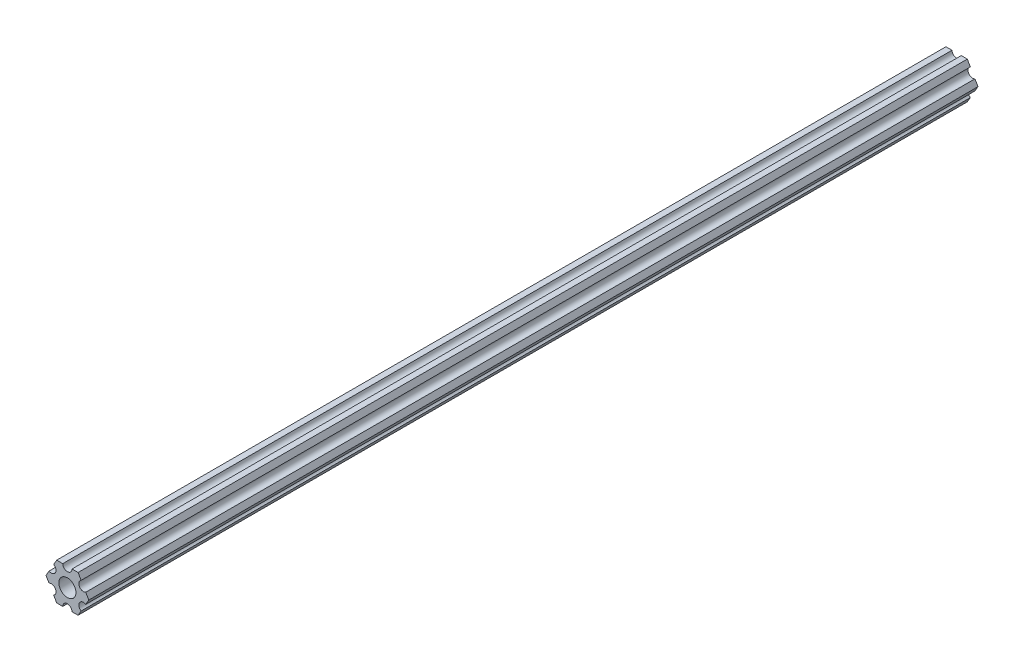
ISO-10303-21;
HEADER;
FILE_DESCRIPTION(('STEP AP214'),'2;1');
FILE_NAME('part.step','',(''),(''),'','','');
FILE_SCHEMA(('AUTOMOTIVE_DESIGN { 1 0 10303 214 1 1 1 1 }'));
ENDSEC;
DATA;
#1=APPLICATION_CONTEXT('core data for automotive mechanical design processes');
#2=APPLICATION_PROTOCOL_DEFINITION('international standard','automotive_design',2000,#1);
#3=PRODUCT_CONTEXT('',#1,'mechanical');
#4=PRODUCT('Part','Part','',(#3));
#5=PRODUCT_RELATED_PRODUCT_CATEGORY('part','',(#4));
#6=PRODUCT_DEFINITION_FORMATION('','',#4);
#7=PRODUCT_DEFINITION_CONTEXT('part definition',#1,'design');
#8=PRODUCT_DEFINITION('design','',#6,#7);
#9=PRODUCT_DEFINITION_SHAPE('','',#8);
#10=(LENGTH_UNIT() NAMED_UNIT(*) SI_UNIT(.MILLI.,.METRE.));
#11=(NAMED_UNIT(*) PLANE_ANGLE_UNIT() SI_UNIT($,.RADIAN.));
#12=(NAMED_UNIT(*) SI_UNIT($,.STERADIAN.) SOLID_ANGLE_UNIT());
#13=UNCERTAINTY_MEASURE_WITH_UNIT(LENGTH_MEASURE(1.E-05),#10,'distance_accuracy_value','');
#14=(GEOMETRIC_REPRESENTATION_CONTEXT(3) GLOBAL_UNCERTAINTY_ASSIGNED_CONTEXT((#13)) GLOBAL_UNIT_ASSIGNED_CONTEXT((#10,
#11,#12)) REPRESENTATION_CONTEXT('',''));
#15=CARTESIAN_POINT('',(0.,0.,0.));
#16=DIRECTION('',(0.,0.,1.));
#17=DIRECTION('',(1.,0.,0.));
#18=AXIS2_PLACEMENT_3D('',#15,#16,#17);
#19=CARTESIAN_POINT('',(6.29301142309098,-1.80018429024546,304.8));
#20=DIRECTION('',(-0.866025434075723,0.499999947533953,0.));
#21=DIRECTION('',(-0.499999947533953,-0.866025434075723,0.));
#22=AXIS2_PLACEMENT_3D('',#19,#20,#21);
#23=PLANE('',#22);
#24=DIRECTION('',(0.,0.,1.));
#25=VECTOR('',#24,1.);
#26=CARTESIAN_POINT('',(7.33234841870826,4.44212519169686E-07,304.8));
#27=LINE('',#26,#25);
#28=CARTESIAN_POINT('',(7.33234841870826,4.44212518961143E-07,0.));
#29=VERTEX_POINT('',#28);
#30=CARTESIAN_POINT('',(7.33234841870826,4.44212519315656E-07,304.8));
#31=VERTEX_POINT('',#30);
#32=EDGE_CURVE('E337',#29,#31,#27,.T.);
#33=ORIENTED_EDGE('',*,*,#32,.T.);
#34=DIRECTION('',(0.499999947533953,0.866025434075723,0.));
#35=VECTOR('',#34,1.);
#36=CARTESIAN_POINT('',(6.29301142309098,-1.80018429024546,304.8));
#37=LINE('',#36,#35);
#38=CARTESIAN_POINT('',(6.29301142309098,-1.80018429024546,304.8));
#39=VERTEX_POINT('',#38);
#40=EDGE_CURVE('E191',#39,#31,#37,.T.);
#41=ORIENTED_EDGE('',*,*,#40,.F.);
#42=DIRECTION('',(0.,0.,-1.));
#43=VECTOR('',#42,1.);
#44=CARTESIAN_POINT('',(6.29301142309098,-1.80018429024546,304.8));
#45=LINE('',#44,#43);
#46=CARTESIAN_POINT('',(6.29301142309098,-1.80018429024546,0.));
#47=VERTEX_POINT('',#46);
#48=EDGE_CURVE('E270',#39,#47,#45,.T.);
#49=ORIENTED_EDGE('',*,*,#48,.T.);
#50=DIRECTION('',(0.499999947533953,0.866025434075723,0.));
#51=VECTOR('',#50,1.);
#52=CARTESIAN_POINT('',(6.29301142309098,-1.80018429024546,0.));
#53=LINE('',#52,#51);
#54=EDGE_CURVE('E196',#47,#29,#53,.T.);
#55=ORIENTED_EDGE('',*,*,#54,.T.);
#56=EDGE_LOOP('',(#33,#41,#49,#55));
#57=FACE_BOUND('',#56,.T.);
#58=ADVANCED_FACE('F17',(#57),#23,.F.);
#59=CARTESIAN_POINT('',(7.33234841870826,4.44212519169686E-07,304.8));
#60=DIRECTION('',(-0.866025373493145,-0.500000052466056,0.));
#61=DIRECTION('',(0.500000052466056,-0.866025373493145,0.));
#62=AXIS2_PLACEMENT_3D('',#59,#60,#61);
#63=PLANE('',#62);
#64=DIRECTION('',(0.,0.,-1.));
#65=VECTOR('',#64,1.);
#66=CARTESIAN_POINT('',(6.29301120497139,1.80018505273895,304.8));
#67=LINE('',#66,#65);
#68=CARTESIAN_POINT('',(6.29301120497139,1.80018505273895,0.));
#69=VERTEX_POINT('',#68);
#70=CARTESIAN_POINT('',(6.29301120497139,1.80018505273895,304.8));
#71=VERTEX_POINT('',#70);
#72=EDGE_CURVE('E334',#69,#71,#67,.F.);
#73=ORIENTED_EDGE('',*,*,#72,.T.);
#74=DIRECTION('',(-0.500000052466056,0.866025373493145,0.));
#75=VECTOR('',#74,1.);
#76=CARTESIAN_POINT('',(7.33234841870826,4.44212519198905E-07,304.8));
#77=LINE('',#76,#75);
#78=EDGE_CURVE('E65',#31,#71,#77,.T.);
#79=ORIENTED_EDGE('',*,*,#78,.F.);
#80=ORIENTED_EDGE('',*,*,#32,.F.);
#81=DIRECTION('',(-0.500000052466056,0.866025373493145,0.));
#82=VECTOR('',#81,1.);
#83=CARTESIAN_POINT('',(7.33234841870826,4.44212519198905E-07,0.));
#84=LINE('',#83,#82);
#85=EDGE_CURVE('E266',#29,#69,#84,.T.);
#86=ORIENTED_EDGE('',*,*,#85,.T.);
#87=EDGE_LOOP('',(#73,#79,#80,#86));
#88=FACE_BOUND('',#87,.T.);
#89=ADVANCED_FACE('F396',(#88),#63,.F.);
#90=CARTESIAN_POINT('',(5.49926112168156,3.17500033315933,304.8));
#91=DIRECTION('',(0.,0.,-1.));
#92=DIRECTION('',(-1.,0.,0.));
#93=AXIS2_PLACEMENT_3D('',#90,#91,#92);
#94=CYLINDRICAL_SURFACE('',#93,1.5875);
#95=CARTESIAN_POINT('',(5.49926112168156,3.17500033315933,304.8));
#96=DIRECTION('',(0.,0.,-1.));
#97=DIRECTION('',(-1.,0.,0.));
#98=AXIS2_PLACEMENT_3D('',#95,#96,#97);
#99=CIRCLE('',#98,1.5875);
#100=CARTESIAN_POINT('',(4.70551103839172,4.54981561357972,304.8));
#101=VERTEX_POINT('',#100);
#102=EDGE_CURVE('E57',#71,#101,#99,.T.);
#103=ORIENTED_EDGE('',*,*,#102,.F.);
#104=ORIENTED_EDGE('',*,*,#72,.F.);
#105=CARTESIAN_POINT('',(5.49926112168156,3.17500033315933,0.));
#106=DIRECTION('',(0.,0.,-1.));
#107=DIRECTION('',(-1.,0.,0.));
#108=AXIS2_PLACEMENT_3D('',#105,#106,#107);
#109=CIRCLE('',#108,1.5875);
#110=CARTESIAN_POINT('',(4.70551103839172,4.54981561357972,0.));
#111=VERTEX_POINT('',#110);
#112=EDGE_CURVE('E20',#69,#111,#109,.T.);
#113=ORIENTED_EDGE('',*,*,#112,.T.);
#114=DIRECTION('',(0.,0.,1.));
#115=VECTOR('',#114,1.);
#116=CARTESIAN_POINT('',(4.70551103839172,4.54981561357972,304.8));
#117=LINE('',#116,#115);
#118=EDGE_CURVE('E329',#111,#101,#117,.T.);
#119=ORIENTED_EDGE('',*,*,#118,.T.);
#120=EDGE_LOOP('',(#103,#104,#113,#119));
#121=FACE_BOUND('',#120,.T.);
#122=ADVANCED_FACE('F394',(#121),#94,.F.);
#123=CARTESIAN_POINT('',(4.70551103839172,4.54981561357972,304.8));
#124=DIRECTION('',(-0.866025373493151,-0.500000052466046,0.));
#125=DIRECTION('',(0.500000052466046,-0.866025373493151,0.));
#126=AXIS2_PLACEMENT_3D('',#123,#124,#125);
#127=PLANE('',#126);
#128=DIRECTION('',(0.,0.,1.));
#129=VECTOR('',#128,1.);
#130=CARTESIAN_POINT('',(3.66617382465481,6.35000022210627,304.8));
#131=LINE('',#130,#129);
#132=CARTESIAN_POINT('',(3.66617382465481,6.35000022210627,0.));
#133=VERTEX_POINT('',#132);
#134=CARTESIAN_POINT('',(3.66617382465481,6.35000022210627,304.8));
#135=VERTEX_POINT('',#134);
#136=EDGE_CURVE('E325',#133,#135,#131,.T.);
#137=ORIENTED_EDGE('',*,*,#136,.T.);
#138=DIRECTION('',(-0.500000052466046,0.866025373493151,0.));
#139=VECTOR('',#138,1.);
#140=CARTESIAN_POINT('',(4.70551103839172,4.54981561357972,304.8));
#141=LINE('',#140,#139);
#142=EDGE_CURVE('E182',#101,#135,#141,.T.);
#143=ORIENTED_EDGE('',*,*,#142,.F.);
#144=ORIENTED_EDGE('',*,*,#118,.F.);
#145=DIRECTION('',(-0.500000052466046,0.866025373493151,0.));
#146=VECTOR('',#145,1.);
#147=CARTESIAN_POINT('',(4.70551103839172,4.54981561357972,0.));
#148=LINE('',#147,#146);
#149=EDGE_CURVE('E258',#111,#133,#148,.T.);
#150=ORIENTED_EDGE('',*,*,#149,.T.);
#151=EDGE_LOOP('',(#137,#143,#144,#150));
#152=FACE_BOUND('',#151,.T.);
#153=ADVANCED_FACE('F387',(#152),#127,.F.);
#154=CARTESIAN_POINT('',(3.66617382465481,6.35000022210627,304.8));
#155=DIRECTION('',(6.05825850611185E-08,-0.999999999999998,0.));
#156=DIRECTION('',(0.999999999999998,6.05825850611185E-08,0.));
#157=AXIS2_PLACEMENT_3D('',#154,#155,#156);
#158=PLANE('',#157);
#159=DIRECTION('',(0.,0.,-1.));
#160=VECTOR('',#159,1.);
#161=CARTESIAN_POINT('',(1.58749961530074,6.35000009617482,304.8));
#162=LINE('',#161,#160);
#163=CARTESIAN_POINT('',(1.58749961530073,6.35000015914054,0.));
#164=VERTEX_POINT('',#163);
#165=CARTESIAN_POINT('',(1.58749961530073,6.35000015914054,304.8));
#166=VERTEX_POINT('',#165);
#167=EDGE_CURVE('E322',#164,#166,#162,.F.);
#168=ORIENTED_EDGE('',*,*,#167,.T.);
#169=DIRECTION('',(1.,0.,0.));
#170=VECTOR('',#169,1.);
#171=CARTESIAN_POINT('',(5.49926112168156,6.35000022210627,304.8));
#172=LINE('',#171,#170);
#173=EDGE_CURVE('E146',#135,#166,#172,.F.);
#174=ORIENTED_EDGE('',*,*,#173,.F.);
#175=ORIENTED_EDGE('',*,*,#136,.F.);
#176=DIRECTION('',(1.,0.,0.));
#177=VECTOR('',#176,1.);
#178=CARTESIAN_POINT('',(5.49926112168156,6.35000022210627,0.));
#179=LINE('',#178,#177);
#180=EDGE_CURVE('E254',#133,#164,#179,.F.);
#181=ORIENTED_EDGE('',*,*,#180,.T.);
#182=EDGE_LOOP('',(#168,#174,#175,#181));
#183=FACE_BOUND('',#182,.T.);
#184=ADVANCED_FACE('F384',(#183),#158,.F.);
#185=CARTESIAN_POINT('',(-3.84699260060323E-07,6.35,304.8));
#186=DIRECTION('',(0.,0.,-1.));
#187=DIRECTION('',(-1.,0.,0.));
#188=AXIS2_PLACEMENT_3D('',#185,#186,#187);
#189=CYLINDRICAL_SURFACE('',#188,1.5875);
#190=DIRECTION('',(0.,0.,1.));
#191=VECTOR('',#190,1.);
#192=CARTESIAN_POINT('',(-1.58750038469926,6.34999990382518,304.8));
#193=LINE('',#192,#191);
#194=CARTESIAN_POINT('',(-1.58750038469926,6.34999990382518,0.));
#195=VERTEX_POINT('',#194);
#196=CARTESIAN_POINT('',(-1.58750038469926,6.34999990382518,304.8));
#197=VERTEX_POINT('',#196);
#198=EDGE_CURVE('E105',#195,#197,#193,.T.);
#199=ORIENTED_EDGE('',*,*,#198,.T.);
#200=CARTESIAN_POINT('',(-3.84699260060323E-07,6.35,304.8));
#201=DIRECTION('',(0.,0.,-1.));
#202=DIRECTION('',(-1.,0.,0.));
#203=AXIS2_PLACEMENT_3D('',#200,#201,#202);
#204=CIRCLE('',#203,1.5875);
#205=EDGE_CURVE('E150',#166,#197,#204,.T.);
#206=ORIENTED_EDGE('',*,*,#205,.F.);
#207=ORIENTED_EDGE('',*,*,#167,.F.);
#208=CARTESIAN_POINT('',(-3.84699260060323E-07,6.35,0.));
#209=DIRECTION('',(0.,0.,-1.));
#210=DIRECTION('',(-1.,0.,0.));
#211=AXIS2_PLACEMENT_3D('',#208,#209,#210);
#212=CIRCLE('',#211,1.5875);
#213=EDGE_CURVE('E251',#164,#195,#212,.T.);
#214=ORIENTED_EDGE('',*,*,#213,.T.);
#215=EDGE_LOOP('',(#199,#206,#207,#214));
#216=FACE_BOUND('',#215,.T.);
#217=ADVANCED_FACE('F378',(#216),#189,.F.);
#218=CARTESIAN_POINT('',(-1.58750038469926,6.34999990382518,304.8));
#219=DIRECTION('',(6.05825963273174E-08,-0.999999999999998,0.));
#220=DIRECTION('',(0.999999999999998,6.05825963273174E-08,0.));
#221=AXIS2_PLACEMENT_3D('',#218,#219,#220);
#222=PLANE('',#221);
#223=DIRECTION('',(0.,0.,1.));
#224=VECTOR('',#223,1.);
#225=CARTESIAN_POINT('',(-3.66617459405349,6.3499997778937,304.8));
#226=LINE('',#225,#224);
#227=CARTESIAN_POINT('',(-3.66617454558244,6.34999986184803,0.));
#228=VERTEX_POINT('',#227);
#229=CARTESIAN_POINT('',(-3.66617454558244,6.34999986184803,304.8));
#230=VERTEX_POINT('',#229);
#231=EDGE_CURVE('E113',#228,#230,#226,.T.);
#232=ORIENTED_EDGE('',*,*,#231,.T.);
#233=DIRECTION('',(1.,0.,0.));
#234=VECTOR('',#233,1.);
#235=CARTESIAN_POINT('',(5.49926112168156,6.34999990382518,304.8));
#236=LINE('',#235,#234);
#237=EDGE_CURVE('E151',#197,#230,#236,.F.);
#238=ORIENTED_EDGE('',*,*,#237,.F.);
#239=ORIENTED_EDGE('',*,*,#198,.F.);
#240=DIRECTION('',(1.,0.,0.));
#241=VECTOR('',#240,1.);
#242=CARTESIAN_POINT('',(5.49926112168156,6.34999990382518,0.));
#243=LINE('',#242,#241);
#244=EDGE_CURVE('E159',#195,#228,#243,.F.);
#245=ORIENTED_EDGE('',*,*,#244,.T.);
#246=EDGE_LOOP('',(#232,#238,#239,#245));
#247=FACE_BOUND('',#246,.T.);
#248=ADVANCED_FACE('F158',(#247),#222,.F.);
#249=CARTESIAN_POINT('',(-3.66617459405349,6.3499997778937,304.8));
#250=DIRECTION('',(0.866025434075729,-0.499999947533942,0.));
#251=DIRECTION('',(0.499999947533942,0.866025434075729,0.));
#252=AXIS2_PLACEMENT_3D('',#249,#250,#251);
#253=PLANE('',#252);
#254=DIRECTION('',(0.,0.,-1.));
#255=VECTOR('',#254,1.);
#256=CARTESIAN_POINT('',(-4.70551158967065,4.54981504343587,304.8));
#257=LINE('',#256,#255);
#258=CARTESIAN_POINT('',(-4.70551158967065,4.54981504343587,0.));
#259=VERTEX_POINT('',#258);
#260=CARTESIAN_POINT('',(-4.70551158967065,4.54981504343587,304.8));
#261=VERTEX_POINT('',#260);
#262=EDGE_CURVE('E161',#259,#261,#257,.F.);
#263=ORIENTED_EDGE('',*,*,#262,.T.);
#264=DIRECTION('',(-0.499999947533943,-0.866025434075729,0.));
#265=VECTOR('',#264,1.);
#266=CARTESIAN_POINT('',(-3.66617459405349,6.3499997778937,304.8));
#267=LINE('',#266,#265);
#268=EDGE_CURVE('E154',#230,#261,#267,.T.);
#269=ORIENTED_EDGE('',*,*,#268,.F.);
#270=ORIENTED_EDGE('',*,*,#231,.F.);
#271=DIRECTION('',(-0.499999947533943,-0.866025434075729,0.));
#272=VECTOR('',#271,1.);
#273=CARTESIAN_POINT('',(-3.66617459405349,6.3499997778937,0.));
#274=LINE('',#273,#272);
#275=EDGE_CURVE('E244',#228,#259,#274,.T.);
#276=ORIENTED_EDGE('',*,*,#275,.T.);
#277=EDGE_LOOP('',(#263,#269,#270,#276));
#278=FACE_BOUND('',#277,.T.);
#279=ADVANCED_FACE('F163',(#278),#253,.F.);
#280=CARTESIAN_POINT('',(-5.49926150638082,3.17499966684067,304.8));
#281=DIRECTION('',(0.,0.,-1.));
#282=DIRECTION('',(-1.,0.,0.));
#283=AXIS2_PLACEMENT_3D('',#280,#281,#282);
#284=CYLINDRICAL_SURFACE('',#283,1.5875);
#285=DIRECTION('',(0.,0.,1.));
#286=VECTOR('',#285,1.);
#287=CARTESIAN_POINT('',(-6.29301142309098,1.80018429024547,304.8));
#288=LINE('',#287,#286);
#289=CARTESIAN_POINT('',(-6.29301142309098,1.80018429024547,0.));
#290=VERTEX_POINT('',#289);
#291=CARTESIAN_POINT('',(-6.29301142309098,1.80018429024547,304.8));
#292=VERTEX_POINT('',#291);
#293=EDGE_CURVE('E310',#290,#292,#288,.T.);
#294=ORIENTED_EDGE('',*,*,#293,.T.);
#295=CARTESIAN_POINT('',(-5.49926150638082,3.17499966684067,304.8));
#296=DIRECTION('',(0.,0.,-1.));
#297=DIRECTION('',(-1.,0.,0.));
#298=AXIS2_PLACEMENT_3D('',#295,#296,#297);
#299=CIRCLE('',#298,1.5875);
#300=EDGE_CURVE('E166',#261,#292,#299,.T.);
#301=ORIENTED_EDGE('',*,*,#300,.F.);
#302=ORIENTED_EDGE('',*,*,#262,.F.);
#303=CARTESIAN_POINT('',(-5.49926150638082,3.17499966684067,0.));
#304=DIRECTION('',(0.,0.,-1.));
#305=DIRECTION('',(-1.,0.,0.));
#306=AXIS2_PLACEMENT_3D('',#303,#304,#305);
#307=CIRCLE('',#306,1.5875);
#308=EDGE_CURVE('E241',#259,#290,#307,.T.);
#309=ORIENTED_EDGE('',*,*,#308,.T.);
#310=EDGE_LOOP('',(#294,#301,#302,#309));
#311=FACE_BOUND('',#310,.T.);
#312=ADVANCED_FACE('F465',(#311),#284,.F.);
#313=CARTESIAN_POINT('',(-6.29301142309098,1.80018429024547,304.8));
#314=DIRECTION('',(0.866025434075724,-0.499999947533951,0.));
#315=DIRECTION('',(0.499999947533951,0.866025434075724,0.));
#316=AXIS2_PLACEMENT_3D('',#313,#314,#315);
#317=PLANE('',#316);
#318=DIRECTION('',(0.,0.,1.));
#319=VECTOR('',#318,1.);
#320=CARTESIAN_POINT('',(-7.33234841870826,-4.44212523790841E-07,304.8));
#321=LINE('',#320,#319);
#322=CARTESIAN_POINT('',(-7.33234841870826,-4.44212524036367E-07,0.));
#323=VERTEX_POINT('',#322);
#324=CARTESIAN_POINT('',(-7.33234841870826,-4.44212524036367E-07,304.8));
#325=VERTEX_POINT('',#324);
#326=EDGE_CURVE('E306',#323,#325,#321,.T.);
#327=ORIENTED_EDGE('',*,*,#326,.T.);
#328=DIRECTION('',(-0.499999947533952,-0.866025434075724,0.));
#329=VECTOR('',#328,1.);
#330=CARTESIAN_POINT('',(-6.29301142309098,1.80018429024547,304.8));
#331=LINE('',#330,#329);
#332=EDGE_CURVE('E170',#292,#325,#331,.T.);
#333=ORIENTED_EDGE('',*,*,#332,.F.);
#334=ORIENTED_EDGE('',*,*,#293,.F.);
#335=DIRECTION('',(-0.499999947533952,-0.866025434075724,0.));
#336=VECTOR('',#335,1.);
#337=CARTESIAN_POINT('',(-6.29301142309098,1.80018429024547,0.));
#338=LINE('',#337,#336);
#339=EDGE_CURVE('E235',#290,#323,#338,.T.);
#340=ORIENTED_EDGE('',*,*,#339,.T.);
#341=EDGE_LOOP('',(#327,#333,#334,#340));
#342=FACE_BOUND('',#341,.T.);
#343=ADVANCED_FACE('F433',(#342),#317,.F.);
#344=CARTESIAN_POINT('',(-7.33234841870826,-4.44212523790841E-07,304.8));
#345=DIRECTION('',(0.866025373493151,0.500000052466045,0.));
#346=DIRECTION('',(-0.500000052466045,0.866025373493151,0.));
#347=AXIS2_PLACEMENT_3D('',#344,#345,#346);
#348=PLANE('',#347);
#349=DIRECTION('',(0.,0.,-1.));
#350=VECTOR('',#349,1.);
#351=CARTESIAN_POINT('',(-6.29301120497141,-1.80018505273896,304.8));
#352=LINE('',#351,#350);
#353=CARTESIAN_POINT('',(-6.29301120497141,-1.80018505273896,0.));
#354=VERTEX_POINT('',#353);
#355=CARTESIAN_POINT('',(-6.29301120497141,-1.80018505273896,304.8));
#356=VERTEX_POINT('',#355);
#357=EDGE_CURVE('E302',#354,#356,#352,.F.);
#358=ORIENTED_EDGE('',*,*,#357,.T.);
#359=DIRECTION('',(0.500000052466045,-0.866025373493151,0.));
#360=VECTOR('',#359,1.);
#361=CARTESIAN_POINT('',(-7.33234841870826,-4.44212523969395E-07,304.8));
#362=LINE('',#361,#360);
#363=EDGE_CURVE('E357',#325,#356,#362,.T.);
#364=ORIENTED_EDGE('',*,*,#363,.F.);
#365=ORIENTED_EDGE('',*,*,#326,.F.);
#366=DIRECTION('',(0.500000052466045,-0.866025373493151,0.));
#367=VECTOR('',#366,1.);
#368=CARTESIAN_POINT('',(-7.33234841870826,-4.44212523969395E-07,0.));
#369=LINE('',#368,#367);
#370=EDGE_CURVE('E231',#323,#354,#369,.T.);
#371=ORIENTED_EDGE('',*,*,#370,.T.);
#372=EDGE_LOOP('',(#358,#364,#365,#371));
#373=FACE_BOUND('',#372,.T.);
#374=ADVANCED_FACE('F437',(#373),#348,.F.);
#375=CARTESIAN_POINT('',(-5.49926112168156,-3.17500033315934,304.8));
#376=DIRECTION('',(0.,0.,-1.));
#377=DIRECTION('',(-1.,0.,0.));
#378=AXIS2_PLACEMENT_3D('',#375,#376,#377);
#379=CYLINDRICAL_SURFACE('',#378,1.5875);
#380=DIRECTION('',(0.,0.,1.));
#381=VECTOR('',#380,1.);
#382=CARTESIAN_POINT('',(-4.70551103839172,-4.54981561357972,304.8));
#383=LINE('',#382,#381);
#384=CARTESIAN_POINT('',(-4.70551103839172,-4.54981561357972,0.));
#385=VERTEX_POINT('',#384);
#386=CARTESIAN_POINT('',(-4.70551103839172,-4.54981561357972,304.8));
#387=VERTEX_POINT('',#386);
#388=EDGE_CURVE('E296',#385,#387,#383,.T.);
#389=ORIENTED_EDGE('',*,*,#388,.T.);
#390=CARTESIAN_POINT('',(-5.49926112168156,-3.17500033315934,304.8));
#391=DIRECTION('',(0.,0.,-1.));
#392=DIRECTION('',(-1.,0.,0.));
#393=AXIS2_PLACEMENT_3D('',#390,#391,#392);
#394=CIRCLE('',#393,1.5875);
#395=EDGE_CURVE('E354',#356,#387,#394,.T.);
#396=ORIENTED_EDGE('',*,*,#395,.F.);
#397=ORIENTED_EDGE('',*,*,#357,.F.);
#398=CARTESIAN_POINT('',(-5.49926112168156,-3.17500033315934,0.));
#399=DIRECTION('',(0.,0.,-1.));
#400=DIRECTION('',(-1.,0.,0.));
#401=AXIS2_PLACEMENT_3D('',#398,#399,#400);
#402=CIRCLE('',#401,1.5875);
#403=EDGE_CURVE('E228',#354,#385,#402,.T.);
#404=ORIENTED_EDGE('',*,*,#403,.T.);
#405=EDGE_LOOP('',(#389,#396,#397,#404));
#406=FACE_BOUND('',#405,.T.);
#407=ADVANCED_FACE('F441',(#406),#379,.F.);
#408=CARTESIAN_POINT('',(-4.70551103839172,-4.54981561357972,304.8));
#409=DIRECTION('',(0.866025373493151,0.500000052466045,0.));
#410=DIRECTION('',(-0.500000052466045,0.866025373493151,0.));
#411=AXIS2_PLACEMENT_3D('',#408,#409,#410);
#412=PLANE('',#411);
#413=DIRECTION('',(0.,0.,1.));
#414=VECTOR('',#413,1.);
#415=CARTESIAN_POINT('',(-3.66617382465481,-6.35000022210628,304.8));
#416=LINE('',#415,#414);
#417=CARTESIAN_POINT('',(-3.6661738246548,-6.35000022210628,0.));
#418=VERTEX_POINT('',#417);
#419=CARTESIAN_POINT('',(-3.6661738246548,-6.35000022210628,304.8));
#420=VERTEX_POINT('',#419);
#421=EDGE_CURVE('E292',#418,#420,#416,.T.);
#422=ORIENTED_EDGE('',*,*,#421,.T.);
#423=DIRECTION('',(0.500000052466045,-0.866025373493151,0.));
#424=VECTOR('',#423,1.);
#425=CARTESIAN_POINT('',(-4.70551103839172,-4.54981561357972,304.8));
#426=LINE('',#425,#424);
#427=EDGE_CURVE('E356',#387,#420,#426,.T.);
#428=ORIENTED_EDGE('',*,*,#427,.F.);
#429=ORIENTED_EDGE('',*,*,#388,.F.);
#430=DIRECTION('',(0.500000052466045,-0.866025373493151,0.));
#431=VECTOR('',#430,1.);
#432=CARTESIAN_POINT('',(-4.70551103839172,-4.54981561357972,0.));
#433=LINE('',#432,#431);
#434=EDGE_CURVE('E222',#385,#418,#433,.T.);
#435=ORIENTED_EDGE('',*,*,#434,.T.);
#436=EDGE_LOOP('',(#422,#428,#429,#435));
#437=FACE_BOUND('',#436,.T.);
#438=ADVANCED_FACE('F447',(#437),#412,.F.);
#439=CARTESIAN_POINT('',(-3.66617382465481,-6.35000022210628,304.8));
#440=DIRECTION('',(-6.05825854783851E-08,0.999999999999998,0.));
#441=DIRECTION('',(-0.999999999999998,-6.05825854783851E-08,0.));
#442=AXIS2_PLACEMENT_3D('',#439,#440,#441);
#443=PLANE('',#442);
#444=DIRECTION('',(0.,0.,-1.));
#445=VECTOR('',#444,1.);
#446=CARTESIAN_POINT('',(-1.58749961530074,-6.35,304.8));
#447=LINE('',#446,#445);
#448=CARTESIAN_POINT('',(-1.58749961530073,-6.35000011105314,0.));
#449=VERTEX_POINT('',#448);
#450=CARTESIAN_POINT('',(-1.58749961530073,-6.35000011105314,304.8));
#451=VERTEX_POINT('',#450);
#452=EDGE_CURVE('E288',#449,#451,#447,.F.);
#453=ORIENTED_EDGE('',*,*,#452,.T.);
#454=DIRECTION('',(1.,0.,0.));
#455=VECTOR('',#454,1.);
#456=CARTESIAN_POINT('',(5.49926112168156,-6.35000022210628,304.8));
#457=LINE('',#456,#455);
#458=EDGE_CURVE('E353',#420,#451,#457,.T.);
#459=ORIENTED_EDGE('',*,*,#458,.F.);
#460=ORIENTED_EDGE('',*,*,#421,.F.);
#461=DIRECTION('',(1.,0.,0.));
#462=VECTOR('',#461,1.);
#463=CARTESIAN_POINT('',(5.49926112168156,-6.35000022210628,0.));
#464=LINE('',#463,#462);
#465=EDGE_CURVE('E218',#418,#449,#464,.T.);
#466=ORIENTED_EDGE('',*,*,#465,.T.);
#467=EDGE_LOOP('',(#453,#459,#460,#466));
#468=FACE_BOUND('',#467,.T.);
#469=ADVANCED_FACE('F451',(#468),#443,.F.);
#470=CARTESIAN_POINT('',(3.8469926204343E-07,-6.35,304.8));
#471=DIRECTION('',(0.,0.,-1.));
#472=DIRECTION('',(-1.,0.,0.));
#473=AXIS2_PLACEMENT_3D('',#470,#471,#472);
#474=CYLINDRICAL_SURFACE('',#473,1.5875);
#475=DIRECTION('',(0.,0.,1.));
#476=VECTOR('',#475,1.);
#477=CARTESIAN_POINT('',(1.58750038469926,-6.34999990382518,304.8));
#478=LINE('',#477,#476);
#479=CARTESIAN_POINT('',(1.58750038469926,-6.34999990382518,0.));
#480=VERTEX_POINT('',#479);
#481=CARTESIAN_POINT('',(1.58750038469926,-6.34999990382518,304.8));
#482=VERTEX_POINT('',#481);
#483=EDGE_CURVE('E282',#480,#482,#478,.T.);
#484=ORIENTED_EDGE('',*,*,#483,.T.);
#485=CARTESIAN_POINT('',(3.8469926204343E-07,-6.35,304.8));
#486=DIRECTION('',(0.,0.,-1.));
#487=DIRECTION('',(-1.,0.,0.));
#488=AXIS2_PLACEMENT_3D('',#485,#486,#487);
#489=CIRCLE('',#488,1.5875);
#490=EDGE_CURVE('E349',#451,#482,#489,.T.);
#491=ORIENTED_EDGE('',*,*,#490,.F.);
#492=ORIENTED_EDGE('',*,*,#452,.F.);
#493=CARTESIAN_POINT('',(3.8469926204343E-07,-6.35,0.));
#494=DIRECTION('',(0.,0.,-1.));
#495=DIRECTION('',(-1.,0.,0.));
#496=AXIS2_PLACEMENT_3D('',#493,#494,#495);
#497=CIRCLE('',#496,1.5875);
#498=EDGE_CURVE('E215',#449,#480,#497,.T.);
#499=ORIENTED_EDGE('',*,*,#498,.T.);
#500=EDGE_LOOP('',(#484,#491,#492,#499));
#501=FACE_BOUND('',#500,.T.);
#502=ADVANCED_FACE('F455',(#501),#474,.F.);
#503=CARTESIAN_POINT('',(1.58750038469926,-6.34999990382518,304.8));
#504=DIRECTION('',(-6.05825721258438E-08,0.999999999999998,0.));
#505=DIRECTION('',(-0.999999999999998,-6.05825721258438E-08,0.));
#506=AXIS2_PLACEMENT_3D('',#503,#504,#505);
#507=PLANE('',#506);
#508=DIRECTION('',(0.,0.,1.));
#509=VECTOR('',#508,1.);
#510=CARTESIAN_POINT('',(3.66617459405346,-6.34999977789375,304.8));
#511=LINE('',#510,#509);
#512=CARTESIAN_POINT('',(3.66617454558244,-6.34999986184804,0.));
#513=VERTEX_POINT('',#512);
#514=CARTESIAN_POINT('',(3.66617454558244,-6.34999986184804,304.8));
#515=VERTEX_POINT('',#514);
#516=EDGE_CURVE('E278',#513,#515,#511,.T.);
#517=ORIENTED_EDGE('',*,*,#516,.T.);
#518=DIRECTION('',(1.,0.,0.));
#519=VECTOR('',#518,1.);
#520=CARTESIAN_POINT('',(5.49926112168156,-6.34999990382518,304.8));
#521=LINE('',#520,#519);
#522=EDGE_CURVE('E352',#482,#515,#521,.T.);
#523=ORIENTED_EDGE('',*,*,#522,.F.);
#524=ORIENTED_EDGE('',*,*,#483,.F.);
#525=DIRECTION('',(1.,0.,0.));
#526=VECTOR('',#525,1.);
#527=CARTESIAN_POINT('',(5.49926112168156,-6.34999990382518,0.));
#528=LINE('',#527,#526);
#529=EDGE_CURVE('E209',#480,#513,#528,.T.);
#530=ORIENTED_EDGE('',*,*,#529,.T.);
#531=EDGE_LOOP('',(#517,#523,#524,#530));
#532=FACE_BOUND('',#531,.T.);
#533=ADVANCED_FACE('F458',(#532),#507,.F.);
#534=CARTESIAN_POINT('',(3.66617459405346,-6.34999977789375,304.8));
#535=DIRECTION('',(-0.86602543407573,0.499999947533941,0.));
#536=DIRECTION('',(-0.499999947533941,-0.86602543407573,0.));
#537=AXIS2_PLACEMENT_3D('',#534,#535,#536);
#538=PLANE('',#537);
#539=DIRECTION('',(0.,0.,1.));
#540=VECTOR('',#539,1.);
#541=CARTESIAN_POINT('',(4.70551158967065,-4.54981504343587,304.8));
#542=LINE('',#541,#540);
#543=CARTESIAN_POINT('',(4.70551158967065,-4.54981504343587,304.8));
#544=VERTEX_POINT('',#543);
#545=CARTESIAN_POINT('',(4.70551158967065,-4.54981504343587,0.));
#546=VERTEX_POINT('',#545);
#547=EDGE_CURVE('E275',#544,#546,#542,.F.);
#548=ORIENTED_EDGE('',*,*,#547,.F.);
#549=DIRECTION('',(0.49999994753394,0.86602543407573,0.));
#550=VECTOR('',#549,1.);
#551=CARTESIAN_POINT('',(3.66617459405346,-6.34999977789376,304.8));
#552=LINE('',#551,#550);
#553=EDGE_CURVE('E348',#515,#544,#552,.T.);
#554=ORIENTED_EDGE('',*,*,#553,.F.);
#555=ORIENTED_EDGE('',*,*,#516,.F.);
#556=DIRECTION('',(0.49999994753394,0.86602543407573,0.));
#557=VECTOR('',#556,1.);
#558=CARTESIAN_POINT('',(3.66617459405346,-6.34999977789376,0.));
#559=LINE('',#558,#557);
#560=EDGE_CURVE('E205',#513,#546,#559,.T.);
#561=ORIENTED_EDGE('',*,*,#560,.T.);
#562=EDGE_LOOP('',(#548,#554,#555,#561));
#563=FACE_BOUND('',#562,.T.);
#564=ADVANCED_FACE('F460',(#563),#538,.F.);
#565=CARTESIAN_POINT('',(5.49926150638082,-3.17499966684067,304.8));
#566=DIRECTION('',(0.,0.,-1.));
#567=DIRECTION('',(-1.,0.,0.));
#568=AXIS2_PLACEMENT_3D('',#565,#566,#567);
#569=CYLINDRICAL_SURFACE('',#568,1.58750000000001);
#570=CARTESIAN_POINT('',(5.49926150638082,-3.17499966684067,304.8));
#571=DIRECTION('',(0.,0.,-1.));
#572=DIRECTION('',(-1.,0.,0.));
#573=AXIS2_PLACEMENT_3D('',#570,#571,#572);
#574=CIRCLE('',#573,1.58750000000001);
#575=EDGE_CURVE('E36',#544,#39,#574,.T.);
#576=ORIENTED_EDGE('',*,*,#575,.F.);
#577=ORIENTED_EDGE('',*,*,#547,.T.);
#578=CARTESIAN_POINT('',(5.49926150638082,-3.17499966684067,0.));
#579=DIRECTION('',(0.,0.,-1.));
#580=DIRECTION('',(-1.,0.,0.));
#581=AXIS2_PLACEMENT_3D('',#578,#579,#580);
#582=CIRCLE('',#581,1.58750000000001);
#583=EDGE_CURVE('E202',#546,#47,#582,.T.);
#584=ORIENTED_EDGE('',*,*,#583,.T.);
#585=ORIENTED_EDGE('',*,*,#48,.F.);
#586=EDGE_LOOP('',(#576,#577,#584,#585));
#587=FACE_BOUND('',#586,.T.);
#588=ADVANCED_FACE('F400',(#587),#569,.F.);
#589=CARTESIAN_POINT('',(5.49926112168156,3.17500033315933,0.));
#590=DIRECTION('',(0.,0.,1.));
#591=DIRECTION('',(1.,0.,0.));
#592=AXIS2_PLACEMENT_3D('',#589,#590,#591);
#593=PLANE('',#592);
#594=CARTESIAN_POINT('',(0.,0.,0.));
#595=DIRECTION('',(0.,0.,-1.));
#596=DIRECTION('',(-1.,0.,0.));
#597=AXIS2_PLACEMENT_3D('',#594,#595,#596);
#598=CIRCLE('',#597,2.9337);
#599=CARTESIAN_POINT('',(-2.9337,0.,0.));
#600=VERTEX_POINT('',#599);
#601=EDGE_CURVE('E27',#600,#600,#598,.F.);
#602=ORIENTED_EDGE('',*,*,#601,.T.);
#603=EDGE_LOOP('',(#602));
#604=FACE_BOUND('',#603,.T.);
#605=ORIENTED_EDGE('',*,*,#583,.F.);
#606=ORIENTED_EDGE('',*,*,#560,.F.);
#607=ORIENTED_EDGE('',*,*,#529,.F.);
#608=ORIENTED_EDGE('',*,*,#498,.F.);
#609=ORIENTED_EDGE('',*,*,#465,.F.);
#610=ORIENTED_EDGE('',*,*,#434,.F.);
#611=ORIENTED_EDGE('',*,*,#403,.F.);
#612=ORIENTED_EDGE('',*,*,#370,.F.);
#613=ORIENTED_EDGE('',*,*,#339,.F.);
#614=ORIENTED_EDGE('',*,*,#308,.F.);
#615=ORIENTED_EDGE('',*,*,#275,.F.);
#616=ORIENTED_EDGE('',*,*,#244,.F.);
#617=ORIENTED_EDGE('',*,*,#213,.F.);
#618=ORIENTED_EDGE('',*,*,#180,.F.);
#619=ORIENTED_EDGE('',*,*,#149,.F.);
#620=ORIENTED_EDGE('',*,*,#112,.F.);
#621=ORIENTED_EDGE('',*,*,#85,.F.);
#622=ORIENTED_EDGE('',*,*,#54,.F.);
#623=EDGE_LOOP('',(#605,#606,#607,#608,#609,#610,#611,#612,#613,#614,#615,#616,#617,#618,#619,
#620,#621,#622));
#624=FACE_BOUND('',#623,.T.);
#625=ADVANCED_FACE('F381',(#604,#624),#593,.F.);
#626=CARTESIAN_POINT('',(5.49926112168156,3.17500033315933,304.8));
#627=DIRECTION('',(0.,0.,1.));
#628=DIRECTION('',(1.,0.,0.));
#629=AXIS2_PLACEMENT_3D('',#626,#627,#628);
#630=PLANE('',#629);
#631=CARTESIAN_POINT('',(0.,0.,304.8));
#632=DIRECTION('',(0.,0.,-1.));
#633=DIRECTION('',(-1.,0.,0.));
#634=AXIS2_PLACEMENT_3D('',#631,#632,#633);
#635=CIRCLE('',#634,2.9337);
#636=CARTESIAN_POINT('',(-2.9337,0.,304.8));
#637=VERTEX_POINT('',#636);
#638=EDGE_CURVE('E10',#637,#637,#635,.T.);
#639=ORIENTED_EDGE('',*,*,#638,.T.);
#640=EDGE_LOOP('',(#639));
#641=FACE_BOUND('',#640,.T.);
#642=ORIENTED_EDGE('',*,*,#553,.T.);
#643=ORIENTED_EDGE('',*,*,#575,.T.);
#644=ORIENTED_EDGE('',*,*,#40,.T.);
#645=ORIENTED_EDGE('',*,*,#78,.T.);
#646=ORIENTED_EDGE('',*,*,#102,.T.);
#647=ORIENTED_EDGE('',*,*,#142,.T.);
#648=ORIENTED_EDGE('',*,*,#173,.T.);
#649=ORIENTED_EDGE('',*,*,#205,.T.);
#650=ORIENTED_EDGE('',*,*,#237,.T.);
#651=ORIENTED_EDGE('',*,*,#268,.T.);
#652=ORIENTED_EDGE('',*,*,#300,.T.);
#653=ORIENTED_EDGE('',*,*,#332,.T.);
#654=ORIENTED_EDGE('',*,*,#363,.T.);
#655=ORIENTED_EDGE('',*,*,#395,.T.);
#656=ORIENTED_EDGE('',*,*,#427,.T.);
#657=ORIENTED_EDGE('',*,*,#458,.T.);
#658=ORIENTED_EDGE('',*,*,#490,.T.);
#659=ORIENTED_EDGE('',*,*,#522,.T.);
#660=EDGE_LOOP('',(#642,#643,#644,#645,#646,#647,#648,#649,#650,#651,#652,#653,#654,#655,#656,
#657,#658,#659));
#661=FACE_BOUND('',#660,.T.);
#662=ADVANCED_FACE('F153',(#641,#661),#630,.T.);
#663=CARTESIAN_POINT('',(0.,0.,304.8));
#664=DIRECTION('',(0.,0.,-1.));
#665=DIRECTION('',(-1.,0.,0.));
#666=AXIS2_PLACEMENT_3D('',#663,#664,#665);
#667=CYLINDRICAL_SURFACE('',#666,2.9337);
#668=ORIENTED_EDGE('',*,*,#601,.F.);
#669=EDGE_LOOP('',(#668));
#670=FACE_BOUND('',#669,.T.);
#671=ORIENTED_EDGE('',*,*,#638,.F.);
#672=EDGE_LOOP('',(#671));
#673=FACE_BOUND('',#672,.T.);
#674=ADVANCED_FACE('F475',(#670,#673),#667,.F.);
#675=CLOSED_SHELL('',(#58,#89,#122,#153,#184,#217,#248,#279,#312,#343,#374,#407,#438,#469,#502,
#533,#564,#588,#625,#662,#674));
#676=MANIFOLD_SOLID_BREP('B1',#675);
#677=ADVANCED_BREP_SHAPE_REPRESENTATION('',(#18,#676),#14);
#678=SHAPE_DEFINITION_REPRESENTATION(#9,#677);
ENDSEC;
END-ISO-10303-21;
